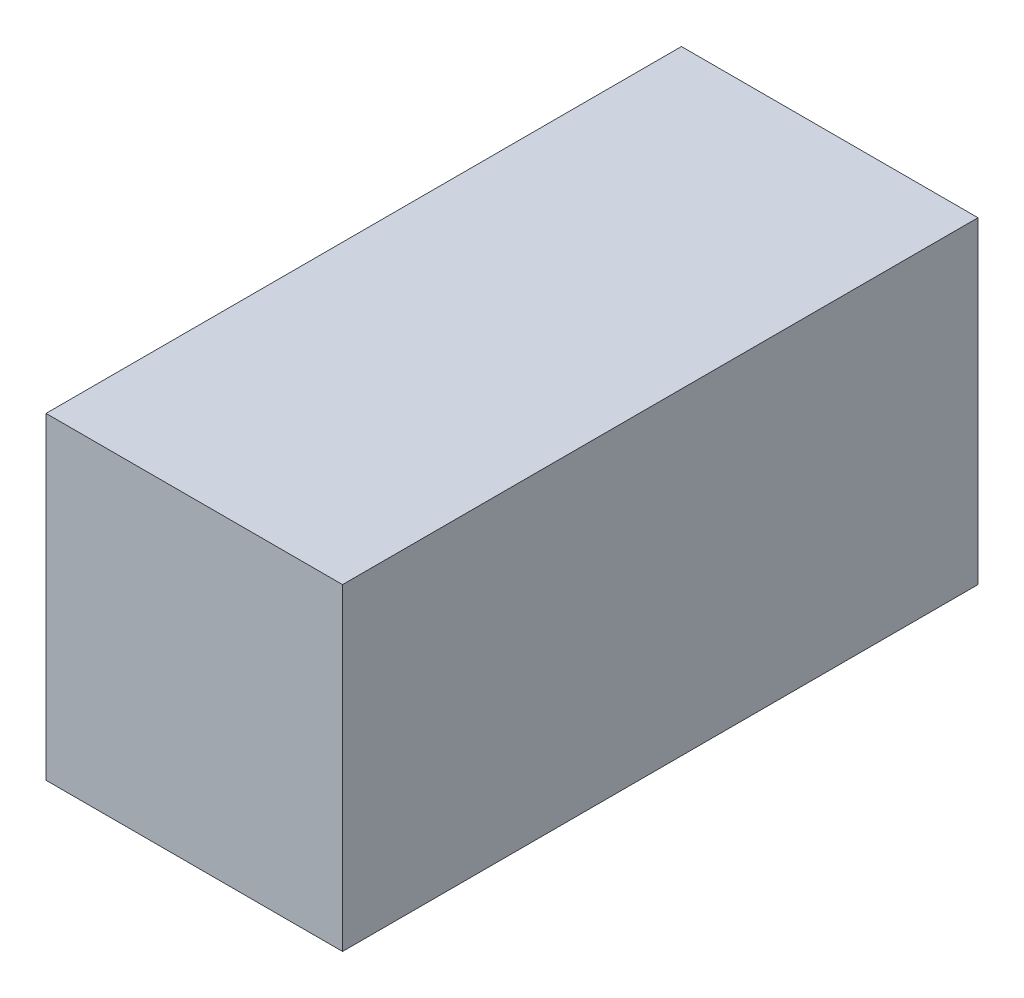
ISO-10303-21;
HEADER;
FILE_DESCRIPTION(('STEP AP214'),'2;1');
FILE_NAME('part.step','',(''),(''),'','','');
FILE_SCHEMA(('AUTOMOTIVE_DESIGN { 1 0 10303 214 1 1 1 1 }'));
ENDSEC;
DATA;
#1=APPLICATION_CONTEXT('core data for automotive mechanical design processes');
#2=APPLICATION_PROTOCOL_DEFINITION('international standard','automotive_design',2000,#1);
#3=PRODUCT_CONTEXT('',#1,'mechanical');
#4=PRODUCT('Part','Part','',(#3));
#5=PRODUCT_RELATED_PRODUCT_CATEGORY('part','',(#4));
#6=PRODUCT_DEFINITION_FORMATION('','',#4);
#7=PRODUCT_DEFINITION_CONTEXT('part definition',#1,'design');
#8=PRODUCT_DEFINITION('design','',#6,#7);
#9=PRODUCT_DEFINITION_SHAPE('','',#8);
#10=(LENGTH_UNIT() NAMED_UNIT(*) SI_UNIT(.MILLI.,.METRE.));
#11=(NAMED_UNIT(*) PLANE_ANGLE_UNIT() SI_UNIT($,.RADIAN.));
#12=(NAMED_UNIT(*) SI_UNIT($,.STERADIAN.) SOLID_ANGLE_UNIT());
#13=UNCERTAINTY_MEASURE_WITH_UNIT(LENGTH_MEASURE(1.E-05),#10,'distance_accuracy_value','');
#14=(GEOMETRIC_REPRESENTATION_CONTEXT(3) GLOBAL_UNCERTAINTY_ASSIGNED_CONTEXT((#13)) GLOBAL_UNIT_ASSIGNED_CONTEXT((#10,
#11,#12)) REPRESENTATION_CONTEXT('',''));
#15=CARTESIAN_POINT('',(0.,0.,0.));
#16=DIRECTION('',(0.,0.,1.));
#17=DIRECTION('',(1.,0.,0.));
#18=AXIS2_PLACEMENT_3D('',#15,#16,#17);
#19=CARTESIAN_POINT('',(380.,405.,-400.));
#20=DIRECTION('',(-1.,0.,0.));
#21=DIRECTION('',(0.,0.,1.));
#22=AXIS2_PLACEMENT_3D('',#19,#20,#21);
#23=PLANE('',#22);
#24=DIRECTION('',(0.,-1.,0.));
#25=VECTOR('',#24,1.);
#26=CARTESIAN_POINT('',(380.,405.,-100.));
#27=LINE('',#26,#25);
#28=CARTESIAN_POINT('',(380.,555.,-100.));
#29=VERTEX_POINT('',#28);
#30=CARTESIAN_POINT('',(380.,405.,-100.));
#31=VERTEX_POINT('',#30);
#32=EDGE_CURVE('E103',#29,#31,#27,.T.);
#33=ORIENTED_EDGE('',*,*,#32,.F.);
#34=DIRECTION('',(0.,0.,1.));
#35=VECTOR('',#34,1.);
#36=CARTESIAN_POINT('',(380.,555.,-400.));
#37=LINE('',#36,#35);
#38=CARTESIAN_POINT('',(380.,555.,-400.));
#39=VERTEX_POINT('',#38);
#40=EDGE_CURVE('E11',#39,#29,#37,.T.);
#41=ORIENTED_EDGE('',*,*,#40,.F.);
#42=DIRECTION('',(0.,-1.,0.));
#43=VECTOR('',#42,1.);
#44=CARTESIAN_POINT('',(380.,405.,-400.));
#45=LINE('',#44,#43);
#46=CARTESIAN_POINT('',(380.,405.,-400.));
#47=VERTEX_POINT('',#46);
#48=EDGE_CURVE('E97',#39,#47,#45,.T.);
#49=ORIENTED_EDGE('',*,*,#48,.T.);
#50=DIRECTION('',(0.,0.,1.));
#51=VECTOR('',#50,1.);
#52=CARTESIAN_POINT('',(380.,405.,-400.));
#53=LINE('',#52,#51);
#54=EDGE_CURVE('E42',#47,#31,#53,.T.);
#55=ORIENTED_EDGE('',*,*,#54,.T.);
#56=EDGE_LOOP('',(#33,#41,#49,#55));
#57=FACE_BOUND('',#56,.T.);
#58=ADVANCED_FACE('F39',(#57),#23,.T.);
#59=CARTESIAN_POINT('',(380.,555.,-400.));
#60=DIRECTION('',(0.,1.,0.));
#61=DIRECTION('',(0.,0.,1.));
#62=AXIS2_PLACEMENT_3D('',#59,#60,#61);
#63=PLANE('',#62);
#64=DIRECTION('',(-1.,0.,0.));
#65=VECTOR('',#64,1.);
#66=CARTESIAN_POINT('',(380.,555.,-100.));
#67=LINE('',#66,#65);
#68=CARTESIAN_POINT('',(520.,555.,-100.));
#69=VERTEX_POINT('',#68);
#70=EDGE_CURVE('E99',#69,#29,#67,.T.);
#71=ORIENTED_EDGE('',*,*,#70,.F.);
#72=DIRECTION('',(0.,0.,1.));
#73=VECTOR('',#72,1.);
#74=CARTESIAN_POINT('',(520.,555.,-400.));
#75=LINE('',#74,#73);
#76=CARTESIAN_POINT('',(520.,555.,-400.));
#77=VERTEX_POINT('',#76);
#78=EDGE_CURVE('E48',#77,#69,#75,.T.);
#79=ORIENTED_EDGE('',*,*,#78,.F.);
#80=DIRECTION('',(-1.,0.,0.));
#81=VECTOR('',#80,1.);
#82=CARTESIAN_POINT('',(380.,555.,-400.));
#83=LINE('',#82,#81);
#84=EDGE_CURVE('E94',#77,#39,#83,.T.);
#85=ORIENTED_EDGE('',*,*,#84,.T.);
#86=ORIENTED_EDGE('',*,*,#40,.T.);
#87=EDGE_LOOP('',(#71,#79,#85,#86));
#88=FACE_BOUND('',#87,.T.);
#89=ADVANCED_FACE('F113',(#88),#63,.T.);
#90=CARTESIAN_POINT('',(520.,405.,-400.));
#91=DIRECTION('',(1.,0.,0.));
#92=DIRECTION('',(0.,0.,-1.));
#93=AXIS2_PLACEMENT_3D('',#90,#91,#92);
#94=PLANE('',#93);
#95=DIRECTION('',(0.,1.,0.));
#96=VECTOR('',#95,1.);
#97=CARTESIAN_POINT('',(520.,405.,-100.));
#98=LINE('',#97,#96);
#99=CARTESIAN_POINT('',(520.,405.,-100.));
#100=VERTEX_POINT('',#99);
#101=EDGE_CURVE('E89',#100,#69,#98,.T.);
#102=ORIENTED_EDGE('',*,*,#101,.F.);
#103=DIRECTION('',(0.,0.,1.));
#104=VECTOR('',#103,1.);
#105=CARTESIAN_POINT('',(520.,405.,-400.));
#106=LINE('',#105,#104);
#107=CARTESIAN_POINT('',(520.,405.,-400.));
#108=VERTEX_POINT('',#107);
#109=EDGE_CURVE('E84',#108,#100,#106,.T.);
#110=ORIENTED_EDGE('',*,*,#109,.F.);
#111=DIRECTION('',(0.,1.,0.));
#112=VECTOR('',#111,1.);
#113=CARTESIAN_POINT('',(520.,405.,-400.));
#114=LINE('',#113,#112);
#115=EDGE_CURVE('E87',#108,#77,#114,.T.);
#116=ORIENTED_EDGE('',*,*,#115,.T.);
#117=ORIENTED_EDGE('',*,*,#78,.T.);
#118=EDGE_LOOP('',(#102,#110,#116,#117));
#119=FACE_BOUND('',#118,.T.);
#120=ADVANCED_FACE('F86',(#119),#94,.T.);
#121=CARTESIAN_POINT('',(380.,405.,-400.));
#122=DIRECTION('',(0.,-1.,0.));
#123=DIRECTION('',(0.,0.,-1.));
#124=AXIS2_PLACEMENT_3D('',#121,#122,#123);
#125=PLANE('',#124);
#126=DIRECTION('',(1.,0.,0.));
#127=VECTOR('',#126,1.);
#128=CARTESIAN_POINT('',(380.,405.,-100.));
#129=LINE('',#128,#127);
#130=EDGE_CURVE('E106',#31,#100,#129,.T.);
#131=ORIENTED_EDGE('',*,*,#130,.F.);
#132=ORIENTED_EDGE('',*,*,#54,.F.);
#133=DIRECTION('',(1.,0.,0.));
#134=VECTOR('',#133,1.);
#135=CARTESIAN_POINT('',(380.,405.,-400.));
#136=LINE('',#135,#134);
#137=EDGE_CURVE('E93',#47,#108,#136,.T.);
#138=ORIENTED_EDGE('',*,*,#137,.T.);
#139=ORIENTED_EDGE('',*,*,#109,.T.);
#140=EDGE_LOOP('',(#131,#132,#138,#139));
#141=FACE_BOUND('',#140,.T.);
#142=ADVANCED_FACE('F96',(#141),#125,.T.);
#143=CARTESIAN_POINT('',(0.,0.,-400.));
#144=DIRECTION('',(0.,0.,-1.));
#145=DIRECTION('',(-1.,0.,0.));
#146=AXIS2_PLACEMENT_3D('',#143,#144,#145);
#147=PLANE('',#146);
#148=ORIENTED_EDGE('',*,*,#48,.F.);
#149=ORIENTED_EDGE('',*,*,#84,.F.);
#150=ORIENTED_EDGE('',*,*,#115,.F.);
#151=ORIENTED_EDGE('',*,*,#137,.F.);
#152=EDGE_LOOP('',(#148,#149,#150,#151));
#153=FACE_BOUND('',#152,.T.);
#154=ADVANCED_FACE('F92',(#153),#147,.T.);
#155=CARTESIAN_POINT('',(0.,0.,-100.));
#156=DIRECTION('',(0.,0.,-1.));
#157=DIRECTION('',(-1.,0.,0.));
#158=AXIS2_PLACEMENT_3D('',#155,#156,#157);
#159=PLANE('',#158);
#160=ORIENTED_EDGE('',*,*,#32,.T.);
#161=ORIENTED_EDGE('',*,*,#130,.T.);
#162=ORIENTED_EDGE('',*,*,#101,.T.);
#163=ORIENTED_EDGE('',*,*,#70,.T.);
#164=EDGE_LOOP('',(#160,#161,#162,#163));
#165=FACE_BOUND('',#164,.T.);
#166=ADVANCED_FACE('F112',(#165),#159,.F.);
#167=CLOSED_SHELL('',(#58,#89,#120,#142,#154,#166));
#168=MANIFOLD_SOLID_BREP('B2',#167);
#169=ADVANCED_BREP_SHAPE_REPRESENTATION('',(#18,#168),#14);
#170=SHAPE_DEFINITION_REPRESENTATION(#9,#169);
ENDSEC;
END-ISO-10303-21;
